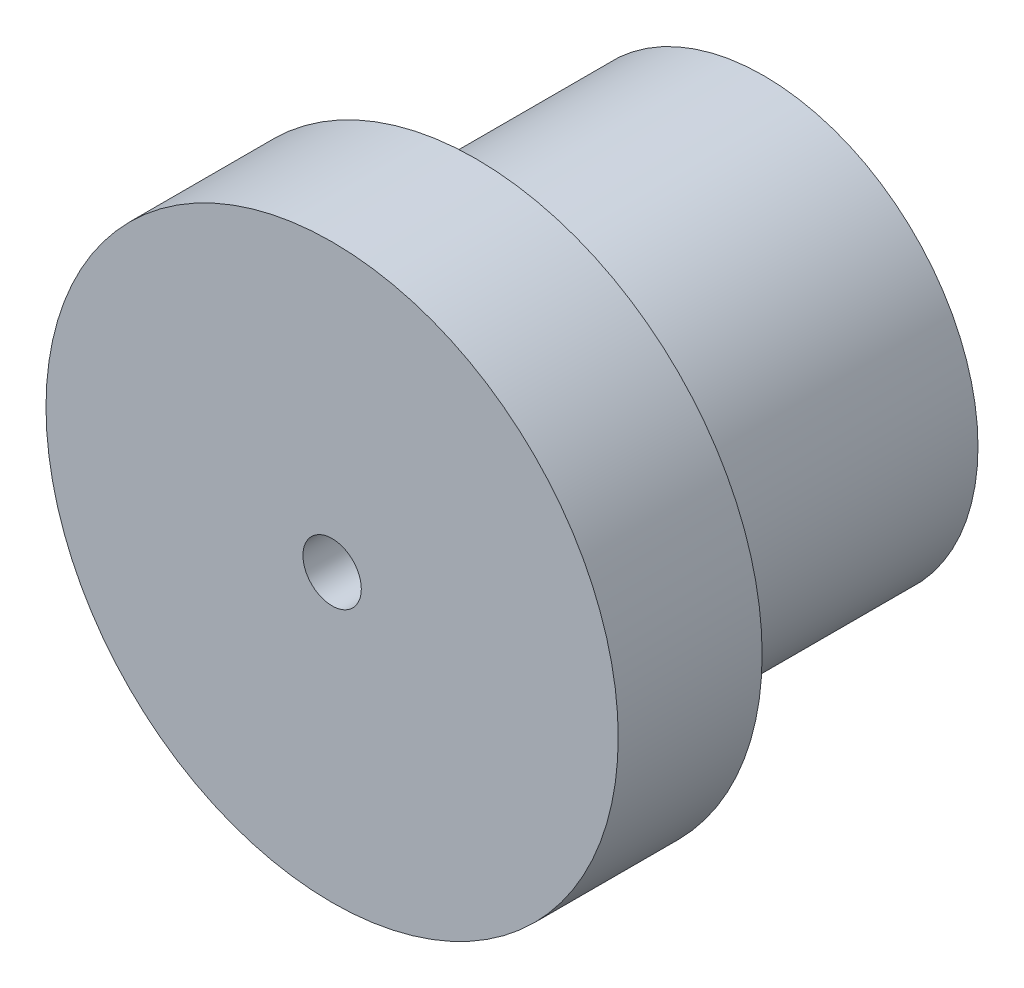
ISO-10303-21;
HEADER;
FILE_DESCRIPTION(('STEP AP214'),'2;1');
FILE_NAME('part.step','',(''),(''),'','','');
FILE_SCHEMA(('AUTOMOTIVE_DESIGN { 1 0 10303 214 1 1 1 1 }'));
ENDSEC;
DATA;
#1=APPLICATION_CONTEXT('core data for automotive mechanical design processes');
#2=APPLICATION_PROTOCOL_DEFINITION('international standard','automotive_design',2000,#1);
#3=PRODUCT_CONTEXT('',#1,'mechanical');
#4=PRODUCT('Part','Part','',(#3));
#5=PRODUCT_RELATED_PRODUCT_CATEGORY('part','',(#4));
#6=PRODUCT_DEFINITION_FORMATION('','',#4);
#7=PRODUCT_DEFINITION_CONTEXT('part definition',#1,'design');
#8=PRODUCT_DEFINITION('design','',#6,#7);
#9=PRODUCT_DEFINITION_SHAPE('','',#8);
#10=(LENGTH_UNIT() NAMED_UNIT(*) SI_UNIT(.MILLI.,.METRE.));
#11=(NAMED_UNIT(*) PLANE_ANGLE_UNIT() SI_UNIT($,.RADIAN.));
#12=(NAMED_UNIT(*) SI_UNIT($,.STERADIAN.) SOLID_ANGLE_UNIT());
#13=UNCERTAINTY_MEASURE_WITH_UNIT(LENGTH_MEASURE(1.E-05),#10,'distance_accuracy_value','');
#14=(GEOMETRIC_REPRESENTATION_CONTEXT(3) GLOBAL_UNCERTAINTY_ASSIGNED_CONTEXT((#13)) GLOBAL_UNIT_ASSIGNED_CONTEXT((#10,
#11,#12)) REPRESENTATION_CONTEXT('',''));
#15=CARTESIAN_POINT('',(0.,0.,0.));
#16=DIRECTION('',(0.,0.,1.));
#17=DIRECTION('',(1.,0.,0.));
#18=AXIS2_PLACEMENT_3D('',#15,#16,#17);
#19=CARTESIAN_POINT('',(-2.24,1.27004921164497,-20.));
#20=DIRECTION('',(0.,1.,0.));
#21=DIRECTION('',(0.,0.,1.));
#22=AXIS2_PLACEMENT_3D('',#19,#20,#21);
#23=PLANE('',#22);
#24=DIRECTION('',(1.,0.,0.));
#25=VECTOR('',#24,1.);
#26=CARTESIAN_POINT('',(-2.24,1.27004921164497,-5.));
#27=LINE('',#26,#25);
#28=CARTESIAN_POINT('',(-2.24,1.27004921164497,-5.));
#29=VERTEX_POINT('',#28);
#30=CARTESIAN_POINT('',(2.24,1.27004921164497,-5.));
#31=VERTEX_POINT('',#30);
#32=EDGE_CURVE('E11',#29,#31,#27,.T.);
#33=ORIENTED_EDGE('',*,*,#32,.F.);
#34=DIRECTION('',(0.,0.,1.));
#35=VECTOR('',#34,1.);
#36=CARTESIAN_POINT('',(-2.24,1.27004921164497,-20.));
#37=LINE('',#36,#35);
#38=CARTESIAN_POINT('',(-2.24,1.27004921164497,-20.));
#39=VERTEX_POINT('',#38);
#40=EDGE_CURVE('E57',#39,#29,#37,.T.);
#41=ORIENTED_EDGE('',*,*,#40,.F.);
#42=DIRECTION('',(-1.,0.,0.));
#43=VECTOR('',#42,1.);
#44=CARTESIAN_POINT('',(-2.24,1.27004921164497,-20.));
#45=LINE('',#44,#43);
#46=CARTESIAN_POINT('',(2.24,1.27004921164497,-20.));
#47=VERTEX_POINT('',#46);
#48=EDGE_CURVE('E72',#47,#39,#45,.T.);
#49=ORIENTED_EDGE('',*,*,#48,.F.);
#50=DIRECTION('',(0.,0.,1.));
#51=VECTOR('',#50,1.);
#52=CARTESIAN_POINT('',(2.24,1.27004921164497,-20.));
#53=LINE('',#52,#51);
#54=EDGE_CURVE('E67',#47,#31,#53,.T.);
#55=ORIENTED_EDGE('',*,*,#54,.T.);
#56=EDGE_LOOP('',(#33,#41,#49,#55));
#57=FACE_BOUND('',#56,.T.);
#58=ADVANCED_FACE('F37',(#57),#23,.F.);
#59=CARTESIAN_POINT('',(0.,0.,-84.1177848998413));
#60=DIRECTION('',(0.,0.,1.));
#61=DIRECTION('',(1.,0.,0.));
#62=AXIS2_PLACEMENT_3D('',#59,#60,#61);
#63=CYLINDRICAL_SURFACE('',#62,25.25);
#64=CARTESIAN_POINT('',(0.,0.,-12.7));
#65=DIRECTION('',(0.,0.,1.));
#66=DIRECTION('',(1.,0.,0.));
#67=AXIS2_PLACEMENT_3D('',#64,#65,#66);
#68=CIRCLE('',#67,25.25);
#69=CARTESIAN_POINT('',(25.25,0.,-12.7));
#70=VERTEX_POINT('',#69);
#71=EDGE_CURVE('E88',#70,#70,#68,.F.);
#72=CARTESIAN_POINT('',(0.,0.,0.));
#73=DIRECTION('',(0.,0.,1.));
#74=DIRECTION('',(1.,0.,0.));
#75=AXIS2_PLACEMENT_3D('',#72,#73,#74);
#76=CIRCLE('',#75,25.25);
#77=CARTESIAN_POINT('',(25.25,0.,0.));
#78=VERTEX_POINT('',#77);
#79=EDGE_CURVE('E91',#78,#78,#76,.T.);
#80=CARTESIAN_POINT('',(25.25,0.,-12.7));
#81=CARTESIAN_POINT('',(25.25,0.,-12.5677083333333));
#82=CARTESIAN_POINT('',(25.25,0.,-12.4354166666667));
#83=CARTESIAN_POINT('',(25.25,0.,-12.1708333333333));
#84=CARTESIAN_POINT('',(25.25,0.,-12.0385416666667));
#85=CARTESIAN_POINT('',(25.25,0.,-11.7739583333333));
#86=CARTESIAN_POINT('',(25.25,0.,-11.6416666666667));
#87=CARTESIAN_POINT('',(25.25,0.,-11.3770833333333));
#88=CARTESIAN_POINT('',(25.25,0.,-11.2447916666667));
#89=CARTESIAN_POINT('',(25.25,0.,-10.9802083333333));
#90=CARTESIAN_POINT('',(25.25,0.,-10.8479166666667));
#91=CARTESIAN_POINT('',(25.25,0.,-10.5833333333333));
#92=CARTESIAN_POINT('',(25.25,0.,-10.4510416666667));
#93=CARTESIAN_POINT('',(25.25,0.,-10.1864583333333));
#94=CARTESIAN_POINT('',(25.25,0.,-10.0541666666667));
#95=CARTESIAN_POINT('',(25.25,0.,-9.78958333333334));
#96=CARTESIAN_POINT('',(25.25,0.,-9.65729166666667));
#97=CARTESIAN_POINT('',(25.25,0.,-9.39270833333334));
#98=CARTESIAN_POINT('',(25.25,0.,-9.26041666666667));
#99=CARTESIAN_POINT('',(25.25,0.,-8.99583333333334));
#100=CARTESIAN_POINT('',(25.25,0.,-8.86354166666667));
#101=CARTESIAN_POINT('',(25.25,0.,-8.59895833333334));
#102=CARTESIAN_POINT('',(25.25,0.,-8.46666666666667));
#103=CARTESIAN_POINT('',(25.25,0.,-8.20208333333334));
#104=CARTESIAN_POINT('',(25.25,0.,-8.06979166666667));
#105=CARTESIAN_POINT('',(25.25,0.,-7.80520833333334));
#106=CARTESIAN_POINT('',(25.25,0.,-7.67291666666667));
#107=CARTESIAN_POINT('',(25.25,0.,-7.40833333333334));
#108=CARTESIAN_POINT('',(25.25,0.,-7.27604166666667));
#109=CARTESIAN_POINT('',(25.25,0.,-7.01145833333334));
#110=CARTESIAN_POINT('',(25.25,0.,-6.87916666666668));
#111=CARTESIAN_POINT('',(25.25,0.,-6.61458333333334));
#112=CARTESIAN_POINT('',(25.25,0.,-6.48229166666668));
#113=CARTESIAN_POINT('',(25.25,0.,-6.21770833333334));
#114=CARTESIAN_POINT('',(25.25,0.,-6.08541666666667));
#115=CARTESIAN_POINT('',(25.25,0.,-5.82083333333334));
#116=CARTESIAN_POINT('',(25.25,0.,-5.68854166666668));
#117=CARTESIAN_POINT('',(25.25,0.,-5.42395833333334));
#118=CARTESIAN_POINT('',(25.25,0.,-5.29166666666668));
#119=CARTESIAN_POINT('',(25.25,0.,-5.02708333333334));
#120=CARTESIAN_POINT('',(25.25,0.,-4.89479166666668));
#121=CARTESIAN_POINT('',(25.25,0.,-4.63020833333335));
#122=CARTESIAN_POINT('',(25.25,0.,-4.49791666666668));
#123=CARTESIAN_POINT('',(25.25,0.,-4.23333333333334));
#124=CARTESIAN_POINT('',(25.25,0.,-4.10104166666668));
#125=CARTESIAN_POINT('',(25.25,0.,-3.83645833333334));
#126=CARTESIAN_POINT('',(25.25,0.,-3.70416666666668));
#127=CARTESIAN_POINT('',(25.25,0.,-3.43958333333335));
#128=CARTESIAN_POINT('',(25.25,0.,-3.30729166666668));
#129=CARTESIAN_POINT('',(25.25,0.,-3.04270833333334));
#130=CARTESIAN_POINT('',(25.25,0.,-2.91041666666667));
#131=CARTESIAN_POINT('',(25.25,0.,-2.64583333333334));
#132=CARTESIAN_POINT('',(25.25,0.,-2.51354166666668));
#133=CARTESIAN_POINT('',(25.25,0.,-2.24895833333335));
#134=CARTESIAN_POINT('',(25.25,0.,-2.11666666666668));
#135=CARTESIAN_POINT('',(25.25,0.,-1.85208333333334));
#136=CARTESIAN_POINT('',(25.25,0.,-1.71979166666667));
#137=CARTESIAN_POINT('',(25.25,0.,-1.45520833333334));
#138=CARTESIAN_POINT('',(25.25,0.,-1.32291666666668));
#139=CARTESIAN_POINT('',(25.25,0.,-1.05833333333335));
#140=CARTESIAN_POINT('',(25.25,0.,-0.926041666666678));
#141=CARTESIAN_POINT('',(25.25,0.,-0.661458333333346));
#142=CARTESIAN_POINT('',(25.25,0.,-0.529166666666682));
#143=CARTESIAN_POINT('',(25.25,0.,-0.26458333333335));
#144=CARTESIAN_POINT('',(25.25,0.,-0.132291666666682));
#145=CARTESIAN_POINT('',(25.25,0.,0.));
#146=B_SPLINE_CURVE_WITH_KNOTS('',3,(#80,#81,#82,#83,#84,#85,#86,#87,#88,#89,#90,#91,#92,#93,
#94,#95,#96,#97,#98,#99,#100,#101,#102,#103,#104,#105,#106,#107,#108,#109,#110,#111,#112,#113,
#114,#115,#116,#117,#118,#119,#120,#121,#122,#123,#124,#125,#126,#127,#128,#129,#130,#131,#132,
#133,#134,#135,#136,#137,#138,#139,#140,#141,#142,#143,#144,#145),.UNSPECIFIED.,.F.,.F.,(4,2,2,
2,2,2,2,2,2,2,2,2,2,2,2,2,2,2,2,2,2,2,2,2,2,2,2,2,2,2,2,2,4),(0.,0.396875000000005,
0.793749999999996,1.190625,1.58749999999999,1.984375,2.38125,2.77812499999999,3.175,3.571875,
3.96874999999999,4.365625,4.7625,5.15937499999999,5.55625,5.95312499999999,6.34999999999999,
6.746875,7.14374999999999,7.540625,7.93749999999999,8.33437499999999,8.73125,9.12812499999999,
9.52499999999999,9.921875,10.31875,10.715625,11.1125,11.509375,11.90625,12.303125,12.7),.UNSPECIFIED.);
#147=EDGE_CURVE('BSEAM39',#70,#78,#146,.T.);
#148=ORIENTED_EDGE('',*,*,#71,.F.);
#149=ORIENTED_EDGE('',*,*,#79,.F.);
#150=ORIENTED_EDGE('',*,*,#147,.T.);
#151=ORIENTED_EDGE('',*,*,#147,.F.);
#152=EDGE_LOOP('',(#148,#150,#149,#151));
#153=FACE_BOUND('',#152,.T.);
#154=ADVANCED_FACE('F39',(#153),#63,.T.);
#155=CARTESIAN_POINT('',(0.,0.,0.));
#156=DIRECTION('',(0.,0.,1.));
#157=DIRECTION('',(1.,0.,0.));
#158=AXIS2_PLACEMENT_3D('',#155,#156,#157);
#159=PLANE('',#158);
#160=CARTESIAN_POINT('',(0.,0.,0.));
#161=DIRECTION('',(0.,0.,1.));
#162=DIRECTION('',(1.,0.,0.));
#163=AXIS2_PLACEMENT_3D('',#160,#161,#162);
#164=CIRCLE('',#163,2.575);
#165=CARTESIAN_POINT('',(2.575,0.,0.));
#166=VERTEX_POINT('',#165);
#167=EDGE_CURVE('E69',#166,#166,#164,.T.);
#168=ORIENTED_EDGE('',*,*,#167,.F.);
#169=EDGE_LOOP('',(#168));
#170=FACE_BOUND('',#169,.T.);
#171=ORIENTED_EDGE('',*,*,#79,.T.);
#172=EDGE_LOOP('',(#171));
#173=FACE_BOUND('',#172,.T.);
#174=ADVANCED_FACE('F100',(#170,#173),#159,.T.);
#175=CARTESIAN_POINT('',(0.,0.,-12.7));
#176=DIRECTION('',(0.,0.,1.));
#177=DIRECTION('',(1.,0.,0.));
#178=AXIS2_PLACEMENT_3D('',#175,#176,#177);
#179=PLANE('',#178);
#180=CARTESIAN_POINT('',(0.,0.,-12.7));
#181=DIRECTION('',(0.,0.,-1.));
#182=DIRECTION('',(-1.,0.,0.));
#183=AXIS2_PLACEMENT_3D('',#180,#181,#182);
#184=CIRCLE('',#183,18.9);
#185=CARTESIAN_POINT('',(18.9,0.,-12.7));
#186=VERTEX_POINT('',#185);
#187=EDGE_CURVE('E45',#186,#186,#184,.T.);
#188=ORIENTED_EDGE('',*,*,#187,.F.);
#189=EDGE_LOOP('',(#188));
#190=FACE_BOUND('',#189,.T.);
#191=ORIENTED_EDGE('',*,*,#71,.T.);
#192=EDGE_LOOP('',(#191));
#193=FACE_BOUND('',#192,.T.);
#194=ADVANCED_FACE('F96',(#190,#193),#179,.F.);
#195=CARTESIAN_POINT('',(0.,0.,-91.557272657703));
#196=DIRECTION('',(0.,0.,1.));
#197=DIRECTION('',(1.,0.,0.));
#198=AXIS2_PLACEMENT_3D('',#195,#196,#197);
#199=CYLINDRICAL_SURFACE('',#198,18.9);
#200=CARTESIAN_POINT('',(0.,0.,-38.1));
#201=DIRECTION('',(0.,0.,1.));
#202=DIRECTION('',(1.,0.,0.));
#203=AXIS2_PLACEMENT_3D('',#200,#201,#202);
#204=CIRCLE('',#203,18.9);
#205=CARTESIAN_POINT('',(18.9,0.,-38.1));
#206=VERTEX_POINT('',#205);
#207=EDGE_CURVE('E83',#206,#206,#204,.T.);
#208=CARTESIAN_POINT('',(18.9,0.,-38.1));
#209=CARTESIAN_POINT('',(18.9,0.,-37.8354166666667));
#210=CARTESIAN_POINT('',(18.9,0.,-37.5708333333333));
#211=CARTESIAN_POINT('',(18.9,0.,-37.0416666666667));
#212=CARTESIAN_POINT('',(18.9,0.,-36.7770833333333));
#213=CARTESIAN_POINT('',(18.9,0.,-36.2479166666667));
#214=CARTESIAN_POINT('',(18.9,0.,-35.9833333333333));
#215=CARTESIAN_POINT('',(18.9,0.,-35.4541666666667));
#216=CARTESIAN_POINT('',(18.9,0.,-35.1895833333333));
#217=CARTESIAN_POINT('',(18.9,0.,-34.6604166666667));
#218=CARTESIAN_POINT('',(18.9,0.,-34.3958333333333));
#219=CARTESIAN_POINT('',(18.9,0.,-33.8666666666667));
#220=CARTESIAN_POINT('',(18.9,0.,-33.6020833333333));
#221=CARTESIAN_POINT('',(18.9,0.,-33.0729166666667));
#222=CARTESIAN_POINT('',(18.9,0.,-32.8083333333333));
#223=CARTESIAN_POINT('',(18.9,0.,-32.2791666666667));
#224=CARTESIAN_POINT('',(18.9,0.,-32.0145833333333));
#225=CARTESIAN_POINT('',(18.9,0.,-31.4854166666667));
#226=CARTESIAN_POINT('',(18.9,0.,-31.2208333333333));
#227=CARTESIAN_POINT('',(18.9,0.,-30.6916666666667));
#228=CARTESIAN_POINT('',(18.9,0.,-30.4270833333333));
#229=CARTESIAN_POINT('',(18.9,0.,-29.8979166666667));
#230=CARTESIAN_POINT('',(18.9,0.,-29.6333333333333));
#231=CARTESIAN_POINT('',(18.9,0.,-29.1041666666667));
#232=CARTESIAN_POINT('',(18.9,0.,-28.8395833333333));
#233=CARTESIAN_POINT('',(18.9,0.,-28.3104166666667));
#234=CARTESIAN_POINT('',(18.9,0.,-28.0458333333333));
#235=CARTESIAN_POINT('',(18.9,0.,-27.5166666666667));
#236=CARTESIAN_POINT('',(18.9,0.,-27.2520833333333));
#237=CARTESIAN_POINT('',(18.9,0.,-26.7229166666667));
#238=CARTESIAN_POINT('',(18.9,0.,-26.4583333333333));
#239=CARTESIAN_POINT('',(18.9,0.,-25.9291666666667));
#240=CARTESIAN_POINT('',(18.9,0.,-25.6645833333333));
#241=CARTESIAN_POINT('',(18.9,0.,-25.1354166666667));
#242=CARTESIAN_POINT('',(18.9,0.,-24.8708333333333));
#243=CARTESIAN_POINT('',(18.9,0.,-24.3416666666667));
#244=CARTESIAN_POINT('',(18.9,0.,-24.0770833333333));
#245=CARTESIAN_POINT('',(18.9,0.,-23.5479166666667));
#246=CARTESIAN_POINT('',(18.9,0.,-23.2833333333333));
#247=CARTESIAN_POINT('',(18.9,0.,-22.7541666666667));
#248=CARTESIAN_POINT('',(18.9,0.,-22.4895833333333));
#249=CARTESIAN_POINT('',(18.9,0.,-21.9604166666667));
#250=CARTESIAN_POINT('',(18.9,0.,-21.6958333333333));
#251=CARTESIAN_POINT('',(18.9,0.,-21.1666666666667));
#252=CARTESIAN_POINT('',(18.9,0.,-20.9020833333333));
#253=CARTESIAN_POINT('',(18.9,0.,-20.3729166666667));
#254=CARTESIAN_POINT('',(18.9,0.,-20.1083333333333));
#255=CARTESIAN_POINT('',(18.9,0.,-19.5791666666667));
#256=CARTESIAN_POINT('',(18.9,0.,-19.3145833333333));
#257=CARTESIAN_POINT('',(18.9,0.,-18.7854166666667));
#258=CARTESIAN_POINT('',(18.9,0.,-18.5208333333333));
#259=CARTESIAN_POINT('',(18.9,0.,-17.9916666666667));
#260=CARTESIAN_POINT('',(18.9,0.,-17.7270833333333));
#261=CARTESIAN_POINT('',(18.9,0.,-17.1979166666667));
#262=CARTESIAN_POINT('',(18.9,0.,-16.9333333333333));
#263=CARTESIAN_POINT('',(18.9,0.,-16.4041666666667));
#264=CARTESIAN_POINT('',(18.9,0.,-16.1395833333333));
#265=CARTESIAN_POINT('',(18.9,0.,-15.6104166666667));
#266=CARTESIAN_POINT('',(18.9,0.,-15.3458333333333));
#267=CARTESIAN_POINT('',(18.9,0.,-14.8166666666667));
#268=CARTESIAN_POINT('',(18.9,0.,-14.5520833333333));
#269=CARTESIAN_POINT('',(18.9,0.,-14.0229166666667));
#270=CARTESIAN_POINT('',(18.9,0.,-13.7583333333333));
#271=CARTESIAN_POINT('',(18.9,0.,-13.2291666666667));
#272=CARTESIAN_POINT('',(18.9,0.,-12.9645833333333));
#273=CARTESIAN_POINT('',(18.9,0.,-12.7));
#274=B_SPLINE_CURVE_WITH_KNOTS('',3,(#208,#209,#210,#211,#212,#213,#214,#215,#216,#217,#218,
#219,#220,#221,#222,#223,#224,#225,#226,#227,#228,#229,#230,#231,#232,#233,#234,#235,#236,#237,
#238,#239,#240,#241,#242,#243,#244,#245,#246,#247,#248,#249,#250,#251,#252,#253,#254,#255,#256,
#257,#258,#259,#260,#261,#262,#263,#264,#265,#266,#267,#268,#269,#270,#271,#272,#273),
.UNSPECIFIED.,.F.,.F.,(4,2,2,2,2,2,2,2,2,2,2,2,2,2,2,2,2,2,2,2,2,2,2,2,2,2,2,2,2,2,2,2,4),(0.,
0.793750000000003,1.5875,2.38125,3.175,3.96875,4.7625,5.55625,6.35,7.14375,7.9375,8.73125,9.525,
10.31875,11.1125,11.90625,12.7,13.49375,14.2875,15.08125,15.875,16.66875,17.4625,18.25625,19.05,
19.84375,20.6375,21.43125,22.225,23.01875,23.8125,24.60625,25.4),.UNSPECIFIED.);
#275=EDGE_CURVE('BSEAM110',#206,#186,#274,.T.);
#276=ORIENTED_EDGE('',*,*,#207,.T.);
#277=ORIENTED_EDGE('',*,*,#187,.T.);
#278=ORIENTED_EDGE('',*,*,#275,.T.);
#279=ORIENTED_EDGE('',*,*,#275,.F.);
#280=EDGE_LOOP('',(#276,#278,#277,#279));
#281=FACE_BOUND('',#280,.T.);
#282=ADVANCED_FACE('F110',(#281),#199,.T.);
#283=CARTESIAN_POINT('',(0.,0.,-38.1));
#284=DIRECTION('',(0.,0.,1.));
#285=DIRECTION('',(1.,0.,0.));
#286=AXIS2_PLACEMENT_3D('',#283,#284,#285);
#287=PLANE('',#286);
#288=CARTESIAN_POINT('',(0.,0.,-38.1));
#289=DIRECTION('',(0.,0.,-1.));
#290=DIRECTION('',(-1.,0.,0.));
#291=AXIS2_PLACEMENT_3D('',#288,#289,#290);
#292=CIRCLE('',#291,4.5);
#293=CARTESIAN_POINT('',(-4.5,0.,-38.1));
#294=VERTEX_POINT('',#293);
#295=EDGE_CURVE('E74',#294,#294,#292,.T.);
#296=ORIENTED_EDGE('',*,*,#295,.F.);
#297=EDGE_LOOP('',(#296));
#298=FACE_BOUND('',#297,.T.);
#299=ORIENTED_EDGE('',*,*,#207,.F.);
#300=EDGE_LOOP('',(#299));
#301=FACE_BOUND('',#300,.T.);
#302=ADVANCED_FACE('F132',(#298,#301),#287,.F.);
#303=CARTESIAN_POINT('',(0.,0.,-25.1));
#304=DIRECTION('',(0.,0.,-1.));
#305=DIRECTION('',(-1.,0.,0.));
#306=AXIS2_PLACEMENT_3D('',#303,#304,#305);
#307=CYLINDRICAL_SURFACE('',#306,4.5);
#308=CARTESIAN_POINT('',(0.,0.,-25.1));
#309=DIRECTION('',(0.,0.,-1.));
#310=DIRECTION('',(-1.,0.,0.));
#311=AXIS2_PLACEMENT_3D('',#308,#309,#310);
#312=CIRCLE('',#311,4.5);
#313=CARTESIAN_POINT('',(-4.5,0.,-25.1));
#314=VERTEX_POINT('',#313);
#315=EDGE_CURVE('E80',#314,#314,#312,.T.);
#316=CARTESIAN_POINT('',(-4.5,0.,-25.1));
#317=CARTESIAN_POINT('',(-4.5,0.,-25.2354166666667));
#318=CARTESIAN_POINT('',(-4.5,0.,-25.3708333333333));
#319=CARTESIAN_POINT('',(-4.5,0.,-25.6416666666667));
#320=CARTESIAN_POINT('',(-4.5,0.,-25.7770833333333));
#321=CARTESIAN_POINT('',(-4.5,0.,-26.0479166666667));
#322=CARTESIAN_POINT('',(-4.5,0.,-26.1833333333333));
#323=CARTESIAN_POINT('',(-4.5,0.,-26.4541666666667));
#324=CARTESIAN_POINT('',(-4.5,0.,-26.5895833333333));
#325=CARTESIAN_POINT('',(-4.5,0.,-26.8604166666667));
#326=CARTESIAN_POINT('',(-4.5,0.,-26.9958333333333));
#327=CARTESIAN_POINT('',(-4.5,0.,-27.2666666666667));
#328=CARTESIAN_POINT('',(-4.5,0.,-27.4020833333333));
#329=CARTESIAN_POINT('',(-4.5,0.,-27.6729166666667));
#330=CARTESIAN_POINT('',(-4.5,0.,-27.8083333333333));
#331=CARTESIAN_POINT('',(-4.5,0.,-28.0791666666667));
#332=CARTESIAN_POINT('',(-4.5,0.,-28.2145833333333));
#333=CARTESIAN_POINT('',(-4.5,0.,-28.4854166666667));
#334=CARTESIAN_POINT('',(-4.5,0.,-28.6208333333333));
#335=CARTESIAN_POINT('',(-4.5,0.,-28.8916666666667));
#336=CARTESIAN_POINT('',(-4.5,0.,-29.0270833333333));
#337=CARTESIAN_POINT('',(-4.5,0.,-29.2979166666667));
#338=CARTESIAN_POINT('',(-4.5,0.,-29.4333333333333));
#339=CARTESIAN_POINT('',(-4.5,0.,-29.7041666666667));
#340=CARTESIAN_POINT('',(-4.5,0.,-29.8395833333333));
#341=CARTESIAN_POINT('',(-4.5,0.,-30.1104166666667));
#342=CARTESIAN_POINT('',(-4.5,0.,-30.2458333333333));
#343=CARTESIAN_POINT('',(-4.5,0.,-30.5166666666667));
#344=CARTESIAN_POINT('',(-4.5,0.,-30.6520833333333));
#345=CARTESIAN_POINT('',(-4.5,0.,-30.9229166666667));
#346=CARTESIAN_POINT('',(-4.5,0.,-31.0583333333333));
#347=CARTESIAN_POINT('',(-4.5,0.,-31.3291666666667));
#348=CARTESIAN_POINT('',(-4.5,0.,-31.4645833333333));
#349=CARTESIAN_POINT('',(-4.5,0.,-31.7354166666667));
#350=CARTESIAN_POINT('',(-4.5,0.,-31.8708333333333));
#351=CARTESIAN_POINT('',(-4.5,0.,-32.1416666666667));
#352=CARTESIAN_POINT('',(-4.5,0.,-32.2770833333333));
#353=CARTESIAN_POINT('',(-4.5,0.,-32.5479166666667));
#354=CARTESIAN_POINT('',(-4.5,0.,-32.6833333333333));
#355=CARTESIAN_POINT('',(-4.5,0.,-32.9541666666667));
#356=CARTESIAN_POINT('',(-4.5,0.,-33.0895833333333));
#357=CARTESIAN_POINT('',(-4.5,0.,-33.3604166666667));
#358=CARTESIAN_POINT('',(-4.5,0.,-33.4958333333333));
#359=CARTESIAN_POINT('',(-4.5,0.,-33.7666666666667));
#360=CARTESIAN_POINT('',(-4.5,0.,-33.9020833333333));
#361=CARTESIAN_POINT('',(-4.5,0.,-34.1729166666667));
#362=CARTESIAN_POINT('',(-4.5,0.,-34.3083333333333));
#363=CARTESIAN_POINT('',(-4.5,0.,-34.5791666666667));
#364=CARTESIAN_POINT('',(-4.5,0.,-34.7145833333333));
#365=CARTESIAN_POINT('',(-4.5,0.,-34.9854166666667));
#366=CARTESIAN_POINT('',(-4.5,0.,-35.1208333333333));
#367=CARTESIAN_POINT('',(-4.5,0.,-35.3916666666667));
#368=CARTESIAN_POINT('',(-4.5,0.,-35.5270833333333));
#369=CARTESIAN_POINT('',(-4.5,0.,-35.7979166666667));
#370=CARTESIAN_POINT('',(-4.5,0.,-35.9333333333333));
#371=CARTESIAN_POINT('',(-4.5,0.,-36.2041666666667));
#372=CARTESIAN_POINT('',(-4.5,0.,-36.3395833333333));
#373=CARTESIAN_POINT('',(-4.5,0.,-36.6104166666667));
#374=CARTESIAN_POINT('',(-4.5,0.,-36.7458333333333));
#375=CARTESIAN_POINT('',(-4.5,0.,-37.0166666666667));
#376=CARTESIAN_POINT('',(-4.5,0.,-37.1520833333333));
#377=CARTESIAN_POINT('',(-4.5,0.,-37.4229166666667));
#378=CARTESIAN_POINT('',(-4.5,0.,-37.5583333333333));
#379=CARTESIAN_POINT('',(-4.5,0.,-37.8291666666667));
#380=CARTESIAN_POINT('',(-4.5,0.,-37.9645833333333));
#381=CARTESIAN_POINT('',(-4.5,0.,-38.1));
#382=B_SPLINE_CURVE_WITH_KNOTS('',3,(#316,#317,#318,#319,#320,#321,#322,#323,#324,#325,#326,
#327,#328,#329,#330,#331,#332,#333,#334,#335,#336,#337,#338,#339,#340,#341,#342,#343,#344,#345,
#346,#347,#348,#349,#350,#351,#352,#353,#354,#355,#356,#357,#358,#359,#360,#361,#362,#363,#364,
#365,#366,#367,#368,#369,#370,#371,#372,#373,#374,#375,#376,#377,#378,#379,#380,#381),
.UNSPECIFIED.,.F.,.F.,(4,2,2,2,2,2,2,2,2,2,2,2,2,2,2,2,2,2,2,2,2,2,2,2,2,2,2,2,2,2,2,2,4),(0.,
0.406249999999997,0.812499999999997,1.21875,1.625,2.03125,2.4375,2.84375,3.25,3.65625,4.0625,
4.46875,4.875,5.28125,5.6875,6.09374999999999,6.5,6.90625,7.3125,7.71875,8.125,8.53125,
8.93749999999999,9.34375,9.74999999999999,10.15625,10.5625,10.96875,11.375,11.78125,12.1875,
12.59375,13.),.UNSPECIFIED.);
#383=EDGE_CURVE('BSEAM128',#314,#294,#382,.T.);
#384=ORIENTED_EDGE('',*,*,#315,.F.);
#385=ORIENTED_EDGE('',*,*,#295,.T.);
#386=ORIENTED_EDGE('',*,*,#383,.T.);
#387=ORIENTED_EDGE('',*,*,#383,.F.);
#388=EDGE_LOOP('',(#384,#386,#385,#387));
#389=FACE_BOUND('',#388,.T.);
#390=ADVANCED_FACE('F128',(#389),#307,.F.);
#391=CARTESIAN_POINT('',(0.,0.,-25.1));
#392=DIRECTION('',(0.,0.,-1.));
#393=DIRECTION('',(-1.,0.,0.));
#394=AXIS2_PLACEMENT_3D('',#391,#392,#393);
#395=PLANE('',#394);
#396=ORIENTED_EDGE('',*,*,#315,.T.);
#397=EDGE_LOOP('',(#396));
#398=FACE_BOUND('',#397,.T.);
#399=ADVANCED_FACE('F124',(#398),#395,.T.);
#400=CARTESIAN_POINT('',(0.,0.,-20.));
#401=DIRECTION('',(0.,0.,1.));
#402=DIRECTION('',(1.,0.,0.));
#403=AXIS2_PLACEMENT_3D('',#400,#401,#402);
#404=CYLINDRICAL_SURFACE('',#403,2.575);
#405=ORIENTED_EDGE('',*,*,#167,.T.);
#406=EDGE_LOOP('',(#405));
#407=FACE_BOUND('',#406,.T.);
#408=CARTESIAN_POINT('',(0.,0.,-5.));
#409=DIRECTION('',(0.,0.,1.));
#410=DIRECTION('',(1.,0.,0.));
#411=AXIS2_PLACEMENT_3D('',#408,#409,#410);
#412=CIRCLE('',#411,2.575);
#413=EDGE_CURVE('E50',#31,#29,#412,.T.);
#414=ORIENTED_EDGE('',*,*,#413,.F.);
#415=ORIENTED_EDGE('',*,*,#54,.F.);
#416=CARTESIAN_POINT('',(0.,0.,-20.));
#417=DIRECTION('',(0.,0.,1.));
#418=DIRECTION('',(1.,0.,0.));
#419=AXIS2_PLACEMENT_3D('',#416,#417,#418);
#420=CIRCLE('',#419,2.575);
#421=EDGE_CURVE('E76',#39,#47,#420,.T.);
#422=ORIENTED_EDGE('',*,*,#421,.F.);
#423=ORIENTED_EDGE('',*,*,#40,.T.);
#424=EDGE_LOOP('',(#414,#415,#422,#423));
#425=FACE_BOUND('',#424,.T.);
#426=ADVANCED_FACE('F66',(#407,#425),#404,.F.);
#427=CARTESIAN_POINT('',(0.,0.,-20.));
#428=DIRECTION('',(0.,0.,1.));
#429=DIRECTION('',(1.,0.,0.));
#430=AXIS2_PLACEMENT_3D('',#427,#428,#429);
#431=PLANE('',#430);
#432=ORIENTED_EDGE('',*,*,#421,.T.);
#433=ORIENTED_EDGE('',*,*,#48,.T.);
#434=EDGE_LOOP('',(#432,#433));
#435=FACE_BOUND('',#434,.T.);
#436=ADVANCED_FACE('F120',(#435),#431,.T.);
#437=CARTESIAN_POINT('',(0.,0.,-5.));
#438=DIRECTION('',(0.,0.,1.));
#439=DIRECTION('',(1.,0.,0.));
#440=AXIS2_PLACEMENT_3D('',#437,#438,#439);
#441=PLANE('',#440);
#442=ORIENTED_EDGE('',*,*,#32,.T.);
#443=ORIENTED_EDGE('',*,*,#413,.T.);
#444=EDGE_LOOP('',(#442,#443));
#445=FACE_BOUND('',#444,.T.);
#446=ADVANCED_FACE('F63',(#445),#441,.T.);
#447=CLOSED_SHELL('',(#58,#154,#174,#194,#282,#302,#390,#399,#426,#436,#446));
#448=MANIFOLD_SOLID_BREP('B2',#447);
#449=ADVANCED_BREP_SHAPE_REPRESENTATION('',(#18,#448),#14);
#450=SHAPE_DEFINITION_REPRESENTATION(#9,#449);
ENDSEC;
END-ISO-10303-21;
